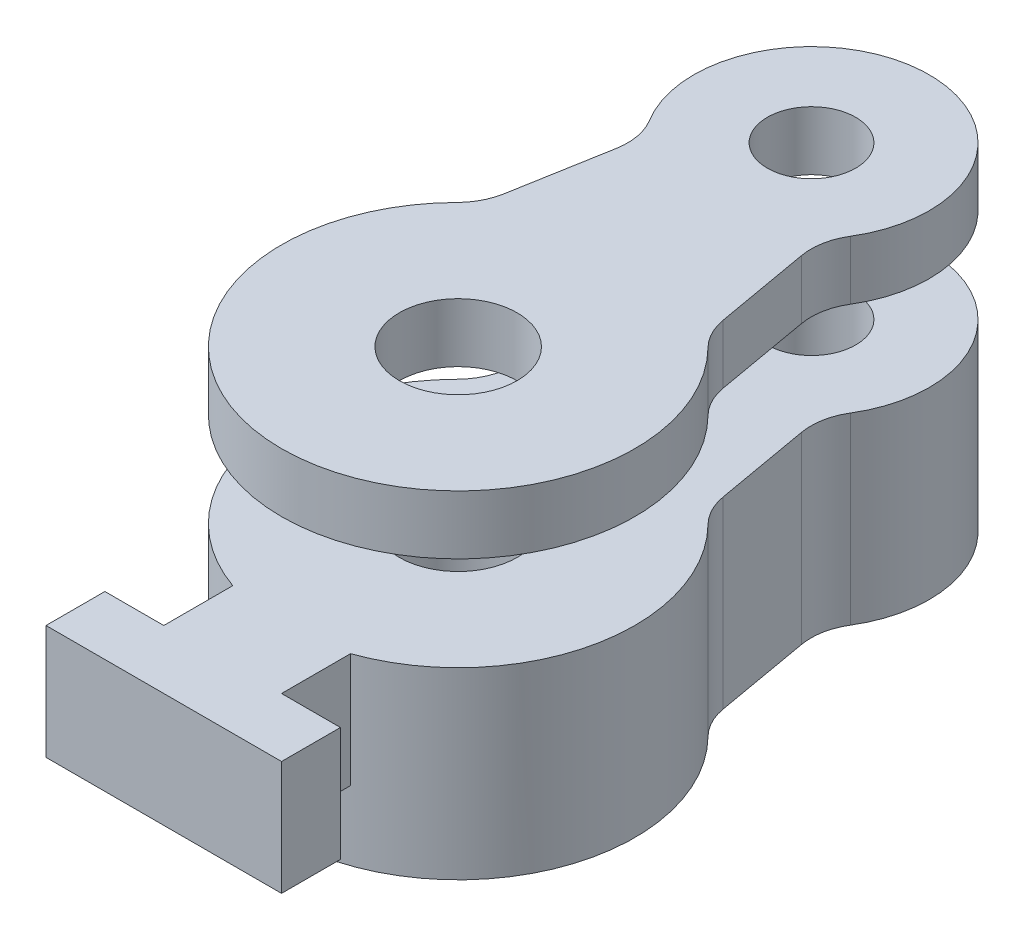
ISO-10303-21;
HEADER;
FILE_DESCRIPTION(('STEP AP214'),'2;1');
FILE_NAME('part.step','',(''),(''),'','','');
FILE_SCHEMA(('AUTOMOTIVE_DESIGN { 1 0 10303 214 1 1 1 1 }'));
ENDSEC;
DATA;
#1=APPLICATION_CONTEXT('core data for automotive mechanical design processes');
#2=APPLICATION_PROTOCOL_DEFINITION('international standard','automotive_design',2000,#1);
#3=PRODUCT_CONTEXT('',#1,'mechanical');
#4=PRODUCT('Part','Part','',(#3));
#5=PRODUCT_RELATED_PRODUCT_CATEGORY('part','',(#4));
#6=PRODUCT_DEFINITION_FORMATION('','',#4);
#7=PRODUCT_DEFINITION_CONTEXT('part definition',#1,'design');
#8=PRODUCT_DEFINITION('design','',#6,#7);
#9=PRODUCT_DEFINITION_SHAPE('','',#8);
#10=(LENGTH_UNIT() NAMED_UNIT(*) SI_UNIT(.MILLI.,.METRE.));
#11=(NAMED_UNIT(*) PLANE_ANGLE_UNIT() SI_UNIT($,.RADIAN.));
#12=(NAMED_UNIT(*) SI_UNIT($,.STERADIAN.) SOLID_ANGLE_UNIT());
#13=UNCERTAINTY_MEASURE_WITH_UNIT(LENGTH_MEASURE(1.E-05),#10,'distance_accuracy_value','');
#14=(GEOMETRIC_REPRESENTATION_CONTEXT(3) GLOBAL_UNCERTAINTY_ASSIGNED_CONTEXT((#13)) GLOBAL_UNIT_ASSIGNED_CONTEXT((#10,
#11,#12)) REPRESENTATION_CONTEXT('',''));
#15=CARTESIAN_POINT('',(0.,0.,0.));
#16=DIRECTION('',(0.,0.,1.));
#17=DIRECTION('',(1.,0.,0.));
#18=AXIS2_PLACEMENT_3D('',#15,#16,#17);
#19=CARTESIAN_POINT('',(32.4918940191016,-59.944,-56.3030951389049));
#20=DIRECTION('',(0.,1.,0.));
#21=DIRECTION('',(0.,0.,1.));
#22=AXIS2_PLACEMENT_3D('',#19,#20,#21);
#23=CYLINDRICAL_SURFACE('',#22,12.7);
#24=CARTESIAN_POINT('',(32.4918940191016,-20.32,-56.3030951389049));
#25=DIRECTION('',(0.,-1.,0.));
#26=DIRECTION('',(0.,0.,1.));
#27=AXIS2_PLACEMENT_3D('',#24,#25,#26);
#28=CIRCLE('',#27,12.7);
#29=CARTESIAN_POINT('',(19.9848355558466,-20.32,-54.0977632825349));
#30=VERTEX_POINT('',#29);
#31=CARTESIAN_POINT('',(21.6612626794011,-20.32,-62.9353967592699));
#32=VERTEX_POINT('',#31);
#33=EDGE_CURVE('E158',#30,#32,#28,.T.);
#34=ORIENTED_EDGE('',*,*,#33,.F.);
#35=DIRECTION('',(0.,1.,0.));
#36=VECTOR('',#35,1.);
#37=CARTESIAN_POINT('',(19.9848355558466,-59.944,-54.0977632825349));
#38=LINE('',#37,#36);
#39=CARTESIAN_POINT('',(19.9848355558466,-59.944,-54.0977632825349));
#40=VERTEX_POINT('',#39);
#41=EDGE_CURVE('E12',#40,#30,#38,.T.);
#42=ORIENTED_EDGE('',*,*,#41,.F.);
#43=CARTESIAN_POINT('',(32.4918940191016,-59.944,-56.3030951389049));
#44=DIRECTION('',(0.,-1.,0.));
#45=DIRECTION('',(0.,0.,1.));
#46=AXIS2_PLACEMENT_3D('',#43,#44,#45);
#47=CIRCLE('',#46,12.7);
#48=CARTESIAN_POINT('',(21.6612626794011,-59.944,-62.9353967592699));
#49=VERTEX_POINT('',#48);
#50=EDGE_CURVE('E181',#40,#49,#47,.T.);
#51=ORIENTED_EDGE('',*,*,#50,.T.);
#52=DIRECTION('',(0.,1.,0.));
#53=VECTOR('',#52,1.);
#54=CARTESIAN_POINT('',(21.6612626794011,-59.944,-62.9353967592699));
#55=LINE('',#54,#53);
#56=EDGE_CURVE('E50',#49,#32,#55,.T.);
#57=ORIENTED_EDGE('',*,*,#56,.T.);
#58=EDGE_LOOP('',(#34,#42,#51,#57));
#59=FACE_BOUND('',#58,.T.);
#60=ADVANCED_FACE('F47',(#59),#23,.F.);
#61=CARTESIAN_POINT('',(23.6142597591815,-59.944,-33.5142757824811));
#62=DIRECTION('',(0.984807753012208,0.,-0.173648177666931));
#63=DIRECTION('',(-0.173648177666931,0.,-0.984807753012208));
#64=AXIS2_PLACEMENT_3D('',#61,#62,#63);
#65=PLANE('',#64);
#66=DIRECTION('',(-0.173648177666931,0.,-0.984807753012208));
#67=VECTOR('',#66,1.);
#68=CARTESIAN_POINT('',(23.6142597591815,-20.32,-33.5142757824811));
#69=LINE('',#68,#67);
#70=CARTESIAN_POINT('',(23.6142597591815,-20.32,-33.5142757824811));
#71=VERTEX_POINT('',#70);
#72=EDGE_CURVE('E179',#71,#30,#69,.T.);
#73=ORIENTED_EDGE('',*,*,#72,.F.);
#74=DIRECTION('',(0.,1.,0.));
#75=VECTOR('',#74,1.);
#76=CARTESIAN_POINT('',(23.6142597591815,-59.944,-33.5142757824811));
#77=LINE('',#76,#75);
#78=CARTESIAN_POINT('',(23.6142597591815,-59.944,-33.5142757824811));
#79=VERTEX_POINT('',#78);
#80=EDGE_CURVE('E55',#79,#71,#77,.T.);
#81=ORIENTED_EDGE('',*,*,#80,.F.);
#82=DIRECTION('',(-0.173648177666931,0.,-0.984807753012208));
#83=VECTOR('',#82,1.);
#84=CARTESIAN_POINT('',(23.6142597591815,-59.944,-33.5142757824811));
#85=LINE('',#84,#83);
#86=EDGE_CURVE('E146',#79,#40,#85,.T.);
#87=ORIENTED_EDGE('',*,*,#86,.T.);
#88=ORIENTED_EDGE('',*,*,#41,.T.);
#89=EDGE_LOOP('',(#73,#81,#87,#88));
#90=FACE_BOUND('',#89,.T.);
#91=ADVANCED_FACE('F192',(#90),#65,.T.);
#92=CARTESIAN_POINT('',(36.1213182224366,-59.944,-35.7196076388512));
#93=DIRECTION('',(0.,1.,0.));
#94=DIRECTION('',(0.,0.,1.));
#95=AXIS2_PLACEMENT_3D('',#92,#93,#94);
#96=CYLINDRICAL_SURFACE('',#95,12.7);
#97=CARTESIAN_POINT('',(36.1213182224366,-20.32,-35.7196076388512));
#98=DIRECTION('',(0.,-1.,0.));
#99=DIRECTION('',(0.,0.,1.));
#100=AXIS2_PLACEMENT_3D('',#97,#98,#99);
#101=CIRCLE('',#100,12.7);
#102=CARTESIAN_POINT('',(27.0909886668275,-20.32,-26.7897057291383));
#103=VERTEX_POINT('',#102);
#104=EDGE_CURVE('E134',#103,#71,#101,.T.);
#105=ORIENTED_EDGE('',*,*,#104,.F.);
#106=DIRECTION('',(0.,1.,0.));
#107=VECTOR('',#106,1.);
#108=CARTESIAN_POINT('',(27.0909886668275,-59.944,-26.7897057291383));
#109=LINE('',#108,#107);
#110=CARTESIAN_POINT('',(27.0909886668275,-59.944,-26.7897057291383));
#111=VERTEX_POINT('',#110);
#112=EDGE_CURVE('E128',#111,#103,#109,.T.);
#113=ORIENTED_EDGE('',*,*,#112,.F.);
#114=CARTESIAN_POINT('',(36.1213182224366,-59.944,-35.7196076388512));
#115=DIRECTION('',(0.,-1.,0.));
#116=DIRECTION('',(0.,0.,1.));
#117=AXIS2_PLACEMENT_3D('',#114,#115,#116);
#118=CIRCLE('',#117,12.7);
#119=EDGE_CURVE('E131',#111,#79,#118,.T.);
#120=ORIENTED_EDGE('',*,*,#119,.T.);
#121=ORIENTED_EDGE('',*,*,#80,.T.);
#122=EDGE_LOOP('',(#105,#113,#120,#121));
#123=FACE_BOUND('',#122,.T.);
#124=ADVANCED_FACE('F130',(#123),#96,.F.);
#125=CARTESIAN_POINT('',(0.,-59.944,0.));
#126=DIRECTION('',(0.,1.,0.));
#127=DIRECTION('',(0.,0.,1.));
#128=AXIS2_PLACEMENT_3D('',#125,#126,#127);
#129=CYLINDRICAL_SURFACE('',#128,38.1);
#130=DIRECTION('',(0.,1.,0.));
#131=VECTOR('',#130,1.);
#132=CARTESIAN_POINT('',(12.7,-44.958,35.9210244842766));
#133=LINE('',#132,#131);
#134=CARTESIAN_POINT('',(12.7,-44.958,35.9210244842766));
#135=VERTEX_POINT('',#134);
#136=CARTESIAN_POINT('',(12.7,-20.32,35.9210244842766));
#137=VERTEX_POINT('',#136);
#138=EDGE_CURVE('E286',#135,#137,#133,.T.);
#139=ORIENTED_EDGE('',*,*,#138,.F.);
#140=CARTESIAN_POINT('',(0.,-44.958,-3.67761376907083E-13));
#141=DIRECTION('',(0.,-1.,0.));
#142=DIRECTION('',(0.,0.,1.));
#143=AXIS2_PLACEMENT_3D('',#140,#141,#142);
#144=CIRCLE('',#143,38.1000000000004);
#145=CARTESIAN_POINT('',(-12.7,-44.958,35.9210244842766));
#146=VERTEX_POINT('',#145);
#147=EDGE_CURVE('E273',#135,#146,#144,.T.);
#148=ORIENTED_EDGE('',*,*,#147,.T.);
#149=DIRECTION('',(0.,1.,0.));
#150=VECTOR('',#149,1.);
#151=CARTESIAN_POINT('',(-12.7,-44.958,35.9210244842766));
#152=LINE('',#151,#150);
#153=CARTESIAN_POINT('',(-12.7,-20.32,35.9210244842766));
#154=VERTEX_POINT('',#153);
#155=EDGE_CURVE('E290',#146,#154,#152,.T.);
#156=ORIENTED_EDGE('',*,*,#155,.T.);
#157=CARTESIAN_POINT('',(0.,-20.32,0.));
#158=DIRECTION('',(0.,1.,0.));
#159=DIRECTION('',(0.,0.,1.));
#160=AXIS2_PLACEMENT_3D('',#157,#158,#159);
#161=CIRCLE('',#160,38.1);
#162=CARTESIAN_POINT('',(-27.0909886668274,-20.32,-26.7897057291384));
#163=VERTEX_POINT('',#162);
#164=EDGE_CURVE('E175',#163,#154,#161,.T.);
#165=ORIENTED_EDGE('',*,*,#164,.F.);
#166=DIRECTION('',(0.,1.,0.));
#167=VECTOR('',#166,1.);
#168=CARTESIAN_POINT('',(-27.0909886668274,-59.944,-26.7897057291384));
#169=LINE('',#168,#167);
#170=CARTESIAN_POINT('',(-27.0909886668274,-59.944,-26.7897057291384));
#171=VERTEX_POINT('',#170);
#172=EDGE_CURVE('E138',#171,#163,#169,.T.);
#173=ORIENTED_EDGE('',*,*,#172,.F.);
#174=CARTESIAN_POINT('',(0.,-59.944,0.));
#175=DIRECTION('',(0.,1.,0.));
#176=DIRECTION('',(0.,0.,1.));
#177=AXIS2_PLACEMENT_3D('',#174,#175,#176);
#178=CIRCLE('',#177,38.1);
#179=EDGE_CURVE('E144',#171,#111,#178,.T.);
#180=ORIENTED_EDGE('',*,*,#179,.T.);
#181=ORIENTED_EDGE('',*,*,#112,.T.);
#182=EDGE_CURVE('E174',#137,#103,#161,.T.);
#183=ORIENTED_EDGE('',*,*,#182,.F.);
#184=EDGE_LOOP('',(#139,#148,#156,#165,#173,#180,#181,#183));
#185=FACE_BOUND('',#184,.T.);
#186=ADVANCED_FACE('F149',(#185),#129,.T.);
#187=CARTESIAN_POINT('',(-36.1213182224366,-59.944,-35.7196076388512));
#188=DIRECTION('',(0.,1.,0.));
#189=DIRECTION('',(0.,0.,1.));
#190=AXIS2_PLACEMENT_3D('',#187,#188,#189);
#191=CYLINDRICAL_SURFACE('',#190,12.7);
#192=CARTESIAN_POINT('',(-36.1213182224366,-20.32,-35.7196076388512));
#193=DIRECTION('',(0.,-1.,0.));
#194=DIRECTION('',(0.,0.,1.));
#195=AXIS2_PLACEMENT_3D('',#192,#193,#194);
#196=CIRCLE('',#195,12.7);
#197=CARTESIAN_POINT('',(-23.6142597591815,-20.32,-33.5142757824811));
#198=VERTEX_POINT('',#197);
#199=EDGE_CURVE('E171',#198,#163,#196,.T.);
#200=ORIENTED_EDGE('',*,*,#199,.F.);
#201=DIRECTION('',(0.,1.,0.));
#202=VECTOR('',#201,1.);
#203=CARTESIAN_POINT('',(-23.6142597591815,-59.944,-33.5142757824811));
#204=LINE('',#203,#202);
#205=CARTESIAN_POINT('',(-23.6142597591815,-59.944,-33.5142757824811));
#206=VERTEX_POINT('',#205);
#207=EDGE_CURVE('E185',#206,#198,#204,.T.);
#208=ORIENTED_EDGE('',*,*,#207,.F.);
#209=CARTESIAN_POINT('',(-36.1213182224366,-59.944,-35.7196076388512));
#210=DIRECTION('',(0.,-1.,0.));
#211=DIRECTION('',(0.,0.,1.));
#212=AXIS2_PLACEMENT_3D('',#209,#210,#211);
#213=CIRCLE('',#212,12.7);
#214=EDGE_CURVE('E151',#206,#171,#213,.T.);
#215=ORIENTED_EDGE('',*,*,#214,.T.);
#216=ORIENTED_EDGE('',*,*,#172,.T.);
#217=EDGE_LOOP('',(#200,#208,#215,#216));
#218=FACE_BOUND('',#217,.T.);
#219=ADVANCED_FACE('F205',(#218),#191,.F.);
#220=CARTESIAN_POINT('',(-19.9848355558466,-59.944,-54.0977632825349));
#221=DIRECTION('',(-0.984807753012208,0.,-0.173648177666932));
#222=DIRECTION('',(-0.173648177666932,0.,0.984807753012208));
#223=AXIS2_PLACEMENT_3D('',#220,#221,#222);
#224=PLANE('',#223);
#225=DIRECTION('',(-0.173648177666932,0.,0.984807753012208));
#226=VECTOR('',#225,1.);
#227=CARTESIAN_POINT('',(-19.9848355558466,-20.32,-54.0977632825349));
#228=LINE('',#227,#226);
#229=CARTESIAN_POINT('',(-19.9848355558466,-20.32,-54.0977632825349));
#230=VERTEX_POINT('',#229);
#231=EDGE_CURVE('E168',#230,#198,#228,.T.);
#232=ORIENTED_EDGE('',*,*,#231,.F.);
#233=DIRECTION('',(0.,1.,0.));
#234=VECTOR('',#233,1.);
#235=CARTESIAN_POINT('',(-19.9848355558466,-59.944,-54.0977632825349));
#236=LINE('',#235,#234);
#237=CARTESIAN_POINT('',(-19.9848355558466,-59.944,-54.0977632825349));
#238=VERTEX_POINT('',#237);
#239=EDGE_CURVE('E187',#238,#230,#236,.T.);
#240=ORIENTED_EDGE('',*,*,#239,.F.);
#241=DIRECTION('',(-0.173648177666932,0.,0.984807753012208));
#242=VECTOR('',#241,1.);
#243=CARTESIAN_POINT('',(-19.9848355558466,-59.944,-54.0977632825349));
#244=LINE('',#243,#242);
#245=EDGE_CURVE('E153',#238,#206,#244,.T.);
#246=ORIENTED_EDGE('',*,*,#245,.T.);
#247=ORIENTED_EDGE('',*,*,#207,.T.);
#248=EDGE_LOOP('',(#232,#240,#246,#247));
#249=FACE_BOUND('',#248,.T.);
#250=ADVANCED_FACE('F208',(#249),#224,.T.);
#251=CARTESIAN_POINT('',(-32.4918940191016,-59.944,-56.3030951389049));
#252=DIRECTION('',(0.,1.,0.));
#253=DIRECTION('',(0.,0.,1.));
#254=AXIS2_PLACEMENT_3D('',#251,#252,#253);
#255=CYLINDRICAL_SURFACE('',#254,12.7);
#256=CARTESIAN_POINT('',(-32.4918940191016,-20.32,-56.3030951389049));
#257=DIRECTION('',(0.,-1.,0.));
#258=DIRECTION('',(0.,0.,1.));
#259=AXIS2_PLACEMENT_3D('',#256,#257,#258);
#260=CIRCLE('',#259,12.7);
#261=CARTESIAN_POINT('',(-21.6612626794011,-20.32,-62.93539675927));
#262=VERTEX_POINT('',#261);
#263=EDGE_CURVE('E165',#262,#230,#260,.T.);
#264=ORIENTED_EDGE('',*,*,#263,.F.);
#265=DIRECTION('',(0.,1.,0.));
#266=VECTOR('',#265,1.);
#267=CARTESIAN_POINT('',(-21.6612626794011,-59.944,-62.93539675927));
#268=LINE('',#267,#266);
#269=CARTESIAN_POINT('',(-21.6612626794011,-59.944,-62.93539675927));
#270=VERTEX_POINT('',#269);
#271=EDGE_CURVE('E188',#270,#262,#268,.T.);
#272=ORIENTED_EDGE('',*,*,#271,.F.);
#273=CARTESIAN_POINT('',(-32.4918940191016,-59.944,-56.3030951389049));
#274=DIRECTION('',(0.,-1.,0.));
#275=DIRECTION('',(0.,0.,1.));
#276=AXIS2_PLACEMENT_3D('',#273,#274,#275);
#277=CIRCLE('',#276,12.7);
#278=EDGE_CURVE('E327',#270,#238,#277,.T.);
#279=ORIENTED_EDGE('',*,*,#278,.T.);
#280=ORIENTED_EDGE('',*,*,#239,.T.);
#281=EDGE_LOOP('',(#264,#272,#279,#280));
#282=FACE_BOUND('',#281,.T.);
#283=ADVANCED_FACE('F212',(#282),#255,.F.);
#284=CARTESIAN_POINT('',(0.,-59.944,-76.2));
#285=DIRECTION('',(0.,1.,0.));
#286=DIRECTION('',(0.,0.,1.));
#287=AXIS2_PLACEMENT_3D('',#284,#285,#286);
#288=CYLINDRICAL_SURFACE('',#287,25.4);
#289=CARTESIAN_POINT('',(0.,-20.32,-76.2));
#290=DIRECTION('',(0.,1.,0.));
#291=DIRECTION('',(0.,0.,1.));
#292=AXIS2_PLACEMENT_3D('',#289,#290,#291);
#293=CIRCLE('',#292,25.4);
#294=EDGE_CURVE('E161',#32,#262,#293,.T.);
#295=ORIENTED_EDGE('',*,*,#294,.F.);
#296=ORIENTED_EDGE('',*,*,#56,.F.);
#297=CARTESIAN_POINT('',(0.,-59.944,-76.2));
#298=DIRECTION('',(0.,1.,0.));
#299=DIRECTION('',(0.,0.,1.));
#300=AXIS2_PLACEMENT_3D('',#297,#298,#299);
#301=CIRCLE('',#300,25.4);
#302=EDGE_CURVE('E325',#49,#270,#301,.T.);
#303=ORIENTED_EDGE('',*,*,#302,.T.);
#304=ORIENTED_EDGE('',*,*,#271,.T.);
#305=EDGE_LOOP('',(#295,#296,#303,#304));
#306=FACE_BOUND('',#305,.T.);
#307=ADVANCED_FACE('F190',(#306),#288,.T.);
#308=CARTESIAN_POINT('',(32.4918940191016,-59.944,-56.3030951389049));
#309=DIRECTION('',(0.,1.,0.));
#310=DIRECTION('',(0.,0.,1.));
#311=AXIS2_PLACEMENT_3D('',#308,#309,#310);
#312=PLANE('',#311);
#313=CARTESIAN_POINT('',(0.,-59.944,0.));
#314=DIRECTION('',(0.,1.,0.));
#315=DIRECTION('',(0.,0.,1.));
#316=AXIS2_PLACEMENT_3D('',#313,#314,#315);
#317=CIRCLE('',#316,12.7);
#318=CARTESIAN_POINT('',(0.,-59.944,12.7));
#319=VERTEX_POINT('',#318);
#320=EDGE_CURVE('E296',#319,#319,#317,.T.);
#321=ORIENTED_EDGE('',*,*,#320,.T.);
#322=EDGE_LOOP('',(#321));
#323=FACE_BOUND('',#322,.T.);
#324=CARTESIAN_POINT('',(0.,-59.944,-76.2));
#325=DIRECTION('',(0.,1.,0.));
#326=DIRECTION('',(0.,0.,1.));
#327=AXIS2_PLACEMENT_3D('',#324,#325,#326);
#328=CIRCLE('',#327,9.52500000000001);
#329=CARTESIAN_POINT('',(0.,-59.944,-66.675));
#330=VERTEX_POINT('',#329);
#331=EDGE_CURVE('E162',#330,#330,#328,.T.);
#332=ORIENTED_EDGE('',*,*,#331,.T.);
#333=EDGE_LOOP('',(#332));
#334=FACE_BOUND('',#333,.T.);
#335=ORIENTED_EDGE('',*,*,#50,.F.);
#336=ORIENTED_EDGE('',*,*,#86,.F.);
#337=ORIENTED_EDGE('',*,*,#119,.F.);
#338=ORIENTED_EDGE('',*,*,#179,.F.);
#339=ORIENTED_EDGE('',*,*,#214,.F.);
#340=ORIENTED_EDGE('',*,*,#245,.F.);
#341=ORIENTED_EDGE('',*,*,#278,.F.);
#342=ORIENTED_EDGE('',*,*,#302,.F.);
#343=EDGE_LOOP('',(#335,#336,#337,#338,#339,#340,#341,#342));
#344=FACE_BOUND('',#343,.T.);
#345=ADVANCED_FACE('F142',(#323,#334,#344),#312,.F.);
#346=CARTESIAN_POINT('',(32.4918940191016,-20.32,-56.3030951389049));
#347=DIRECTION('',(0.,1.,0.));
#348=DIRECTION('',(0.,0.,1.));
#349=AXIS2_PLACEMENT_3D('',#346,#347,#348);
#350=PLANE('',#349);
#351=CARTESIAN_POINT('',(0.,-20.32,0.));
#352=DIRECTION('',(0.,1.,0.));
#353=DIRECTION('',(0.,0.,1.));
#354=AXIS2_PLACEMENT_3D('',#351,#352,#353);
#355=CIRCLE('',#354,12.7);
#356=CARTESIAN_POINT('',(0.,-20.32,12.7));
#357=VERTEX_POINT('',#356);
#358=EDGE_CURVE('E293',#357,#357,#355,.T.);
#359=ORIENTED_EDGE('',*,*,#358,.F.);
#360=EDGE_LOOP('',(#359));
#361=FACE_BOUND('',#360,.T.);
#362=CARTESIAN_POINT('',(0.,-20.32,-76.2));
#363=DIRECTION('',(0.,1.,0.));
#364=DIRECTION('',(0.,0.,1.));
#365=AXIS2_PLACEMENT_3D('',#362,#363,#364);
#366=CIRCLE('',#365,9.52500000000001);
#367=CARTESIAN_POINT('',(0.,-20.32,-66.675));
#368=VERTEX_POINT('',#367);
#369=EDGE_CURVE('E318',#368,#368,#366,.T.);
#370=ORIENTED_EDGE('',*,*,#369,.F.);
#371=EDGE_LOOP('',(#370));
#372=FACE_BOUND('',#371,.T.);
#373=ORIENTED_EDGE('',*,*,#33,.T.);
#374=ORIENTED_EDGE('',*,*,#294,.T.);
#375=ORIENTED_EDGE('',*,*,#263,.T.);
#376=ORIENTED_EDGE('',*,*,#231,.T.);
#377=ORIENTED_EDGE('',*,*,#199,.T.);
#378=ORIENTED_EDGE('',*,*,#164,.T.);
#379=DIRECTION('',(0.,0.,1.));
#380=VECTOR('',#379,1.);
#381=CARTESIAN_POINT('',(-12.7,-20.32,35.9210244842766));
#382=LINE('',#381,#380);
#383=CARTESIAN_POINT('',(-12.7,-20.32,50.8));
#384=VERTEX_POINT('',#383);
#385=EDGE_CURVE('E341',#154,#384,#382,.T.);
#386=ORIENTED_EDGE('',*,*,#385,.T.);
#387=DIRECTION('',(-1.,0.,0.));
#388=VECTOR('',#387,1.);
#389=CARTESIAN_POINT('',(-12.7,-20.32,50.8));
#390=LINE('',#389,#388);
#391=CARTESIAN_POINT('',(-25.4,-20.32,50.8));
#392=VERTEX_POINT('',#391);
#393=EDGE_CURVE('E383',#384,#392,#390,.T.);
#394=ORIENTED_EDGE('',*,*,#393,.T.);
#395=DIRECTION('',(0.,0.,1.));
#396=VECTOR('',#395,1.);
#397=CARTESIAN_POINT('',(-25.4,-20.32,50.8));
#398=LINE('',#397,#396);
#399=CARTESIAN_POINT('',(-25.4,-20.32,63.5));
#400=VERTEX_POINT('',#399);
#401=EDGE_CURVE('E379',#392,#400,#398,.T.);
#402=ORIENTED_EDGE('',*,*,#401,.T.);
#403=DIRECTION('',(1.,0.,0.));
#404=VECTOR('',#403,1.);
#405=CARTESIAN_POINT('',(-25.4,-20.32,63.5));
#406=LINE('',#405,#404);
#407=CARTESIAN_POINT('',(25.4,-20.32,63.5));
#408=VERTEX_POINT('',#407);
#409=EDGE_CURVE('E377',#400,#408,#406,.T.);
#410=ORIENTED_EDGE('',*,*,#409,.T.);
#411=DIRECTION('',(0.,0.,-1.));
#412=VECTOR('',#411,1.);
#413=CARTESIAN_POINT('',(25.4,-20.32,63.5));
#414=LINE('',#413,#412);
#415=CARTESIAN_POINT('',(25.4,-20.32,50.8));
#416=VERTEX_POINT('',#415);
#417=EDGE_CURVE('E370',#408,#416,#414,.T.);
#418=ORIENTED_EDGE('',*,*,#417,.T.);
#419=DIRECTION('',(-1.,0.,0.));
#420=VECTOR('',#419,1.);
#421=CARTESIAN_POINT('',(25.4,-20.32,50.8));
#422=LINE('',#421,#420);
#423=CARTESIAN_POINT('',(12.7,-20.32,50.8));
#424=VERTEX_POINT('',#423);
#425=EDGE_CURVE('E374',#416,#424,#422,.T.);
#426=ORIENTED_EDGE('',*,*,#425,.T.);
#427=DIRECTION('',(0.,0.,-1.));
#428=VECTOR('',#427,1.);
#429=CARTESIAN_POINT('',(12.7,-20.32,50.8));
#430=LINE('',#429,#428);
#431=EDGE_CURVE('E63',#424,#137,#430,.T.);
#432=ORIENTED_EDGE('',*,*,#431,.T.);
#433=ORIENTED_EDGE('',*,*,#182,.T.);
#434=ORIENTED_EDGE('',*,*,#104,.T.);
#435=ORIENTED_EDGE('',*,*,#72,.T.);
#436=EDGE_LOOP('',(#373,#374,#375,#376,#377,#378,#386,#394,#402,#410,#418,#426,#432,#433,#434,#435));
#437=FACE_BOUND('',#436,.T.);
#438=ADVANCED_FACE('F191',(#361,#372,#437),#350,.T.);
#439=CARTESIAN_POINT('',(0.,-59.944,-76.2));
#440=DIRECTION('',(0.,1.,0.));
#441=DIRECTION('',(0.,0.,1.));
#442=AXIS2_PLACEMENT_3D('',#439,#440,#441);
#443=CYLINDRICAL_SURFACE('',#442,9.52500000000001);
#444=ORIENTED_EDGE('',*,*,#331,.F.);
#445=EDGE_LOOP('',(#444));
#446=FACE_BOUND('',#445,.T.);
#447=ORIENTED_EDGE('',*,*,#369,.T.);
#448=EDGE_LOOP('',(#447));
#449=FACE_BOUND('',#448,.T.);
#450=ADVANCED_FACE('F224',(#446,#449),#443,.F.);
#451=CARTESIAN_POINT('',(0.,-59.944,0.));
#452=DIRECTION('',(0.,1.,0.));
#453=DIRECTION('',(0.,0.,1.));
#454=AXIS2_PLACEMENT_3D('',#451,#452,#453);
#455=CYLINDRICAL_SURFACE('',#454,12.7);
#456=ORIENTED_EDGE('',*,*,#320,.F.);
#457=EDGE_LOOP('',(#456));
#458=FACE_BOUND('',#457,.T.);
#459=ORIENTED_EDGE('',*,*,#358,.T.);
#460=EDGE_LOOP('',(#459));
#461=FACE_BOUND('',#460,.T.);
#462=ADVANCED_FACE('F231',(#458,#461),#455,.F.);
#463=CARTESIAN_POINT('',(12.7,-44.958,50.8));
#464=DIRECTION('',(1.,0.,0.));
#465=DIRECTION('',(0.,0.,-1.));
#466=AXIS2_PLACEMENT_3D('',#463,#464,#465);
#467=PLANE('',#466);
#468=ORIENTED_EDGE('',*,*,#431,.F.);
#469=DIRECTION('',(0.,1.,0.));
#470=VECTOR('',#469,1.);
#471=CARTESIAN_POINT('',(12.7,-44.958,50.8));
#472=LINE('',#471,#470);
#473=CARTESIAN_POINT('',(12.7,-44.958,50.8));
#474=VERTEX_POINT('',#473);
#475=EDGE_CURVE('E288',#474,#424,#472,.T.);
#476=ORIENTED_EDGE('',*,*,#475,.F.);
#477=DIRECTION('',(0.,0.,-1.));
#478=VECTOR('',#477,1.);
#479=CARTESIAN_POINT('',(12.7,-44.958,50.8));
#480=LINE('',#479,#478);
#481=EDGE_CURVE('E277',#474,#135,#480,.T.);
#482=ORIENTED_EDGE('',*,*,#481,.T.);
#483=ORIENTED_EDGE('',*,*,#138,.T.);
#484=EDGE_LOOP('',(#468,#476,#482,#483));
#485=FACE_BOUND('',#484,.T.);
#486=ADVANCED_FACE('F235',(#485),#467,.T.);
#487=CARTESIAN_POINT('',(25.4,-44.958,50.8));
#488=DIRECTION('',(0.,0.,-1.));
#489=DIRECTION('',(-1.,0.,0.));
#490=AXIS2_PLACEMENT_3D('',#487,#488,#489);
#491=PLANE('',#490);
#492=ORIENTED_EDGE('',*,*,#425,.F.);
#493=DIRECTION('',(0.,1.,0.));
#494=VECTOR('',#493,1.);
#495=CARTESIAN_POINT('',(25.4,-44.958,50.8));
#496=LINE('',#495,#494);
#497=CARTESIAN_POINT('',(25.4,-44.958,50.8));
#498=VERTEX_POINT('',#497);
#499=EDGE_CURVE('E298',#498,#416,#496,.T.);
#500=ORIENTED_EDGE('',*,*,#499,.F.);
#501=DIRECTION('',(-1.,0.,0.));
#502=VECTOR('',#501,1.);
#503=CARTESIAN_POINT('',(25.4,-44.958,50.8));
#504=LINE('',#503,#502);
#505=EDGE_CURVE('E291',#498,#474,#504,.T.);
#506=ORIENTED_EDGE('',*,*,#505,.T.);
#507=ORIENTED_EDGE('',*,*,#475,.T.);
#508=EDGE_LOOP('',(#492,#500,#506,#507));
#509=FACE_BOUND('',#508,.T.);
#510=ADVANCED_FACE('F257',(#509),#491,.T.);
#511=CARTESIAN_POINT('',(25.4,-44.958,63.5));
#512=DIRECTION('',(1.,0.,0.));
#513=DIRECTION('',(0.,0.,-1.));
#514=AXIS2_PLACEMENT_3D('',#511,#512,#513);
#515=PLANE('',#514);
#516=ORIENTED_EDGE('',*,*,#417,.F.);
#517=DIRECTION('',(0.,1.,0.));
#518=VECTOR('',#517,1.);
#519=CARTESIAN_POINT('',(25.4,-44.958,63.5));
#520=LINE('',#519,#518);
#521=CARTESIAN_POINT('',(25.4,-44.958,63.5));
#522=VERTEX_POINT('',#521);
#523=EDGE_CURVE('E305',#522,#408,#520,.T.);
#524=ORIENTED_EDGE('',*,*,#523,.F.);
#525=DIRECTION('',(0.,0.,-1.));
#526=VECTOR('',#525,1.);
#527=CARTESIAN_POINT('',(25.4,-44.958,63.5));
#528=LINE('',#527,#526);
#529=EDGE_CURVE('E373',#522,#498,#528,.T.);
#530=ORIENTED_EDGE('',*,*,#529,.T.);
#531=ORIENTED_EDGE('',*,*,#499,.T.);
#532=EDGE_LOOP('',(#516,#524,#530,#531));
#533=FACE_BOUND('',#532,.T.);
#534=ADVANCED_FACE('F253',(#533),#515,.T.);
#535=CARTESIAN_POINT('',(-25.4,-44.958,63.5));
#536=DIRECTION('',(0.,0.,1.));
#537=DIRECTION('',(1.,0.,0.));
#538=AXIS2_PLACEMENT_3D('',#535,#536,#537);
#539=PLANE('',#538);
#540=ORIENTED_EDGE('',*,*,#409,.F.);
#541=DIRECTION('',(0.,1.,0.));
#542=VECTOR('',#541,1.);
#543=CARTESIAN_POINT('',(-25.4,-44.958,63.5));
#544=LINE('',#543,#542);
#545=CARTESIAN_POINT('',(-25.4,-44.958,63.5));
#546=VERTEX_POINT('',#545);
#547=EDGE_CURVE('E308',#546,#400,#544,.T.);
#548=ORIENTED_EDGE('',*,*,#547,.F.);
#549=DIRECTION('',(1.,0.,0.));
#550=VECTOR('',#549,1.);
#551=CARTESIAN_POINT('',(-25.4,-44.958,63.5));
#552=LINE('',#551,#550);
#553=EDGE_CURVE('E389',#546,#522,#552,.T.);
#554=ORIENTED_EDGE('',*,*,#553,.T.);
#555=ORIENTED_EDGE('',*,*,#523,.T.);
#556=EDGE_LOOP('',(#540,#548,#554,#555));
#557=FACE_BOUND('',#556,.T.);
#558=ADVANCED_FACE('F249',(#557),#539,.T.);
#559=CARTESIAN_POINT('',(-25.4,-44.958,50.8));
#560=DIRECTION('',(-1.,0.,0.));
#561=DIRECTION('',(0.,0.,1.));
#562=AXIS2_PLACEMENT_3D('',#559,#560,#561);
#563=PLANE('',#562);
#564=ORIENTED_EDGE('',*,*,#401,.F.);
#565=DIRECTION('',(0.,1.,0.));
#566=VECTOR('',#565,1.);
#567=CARTESIAN_POINT('',(-25.4,-44.958,50.8));
#568=LINE('',#567,#566);
#569=CARTESIAN_POINT('',(-25.4,-44.958,50.8));
#570=VERTEX_POINT('',#569);
#571=EDGE_CURVE('E311',#570,#392,#568,.T.);
#572=ORIENTED_EDGE('',*,*,#571,.F.);
#573=DIRECTION('',(0.,0.,1.));
#574=VECTOR('',#573,1.);
#575=CARTESIAN_POINT('',(-25.4,-44.958,50.8));
#576=LINE('',#575,#574);
#577=EDGE_CURVE('E392',#570,#546,#576,.T.);
#578=ORIENTED_EDGE('',*,*,#577,.T.);
#579=ORIENTED_EDGE('',*,*,#547,.T.);
#580=EDGE_LOOP('',(#564,#572,#578,#579));
#581=FACE_BOUND('',#580,.T.);
#582=ADVANCED_FACE('F245',(#581),#563,.T.);
#583=CARTESIAN_POINT('',(-12.7,-44.958,50.8));
#584=DIRECTION('',(0.,0.,-1.));
#585=DIRECTION('',(-1.,0.,0.));
#586=AXIS2_PLACEMENT_3D('',#583,#584,#585);
#587=PLANE('',#586);
#588=ORIENTED_EDGE('',*,*,#393,.F.);
#589=DIRECTION('',(0.,1.,0.));
#590=VECTOR('',#589,1.);
#591=CARTESIAN_POINT('',(-12.7,-44.958,50.8));
#592=LINE('',#591,#590);
#593=CARTESIAN_POINT('',(-12.7,-44.958,50.8));
#594=VERTEX_POINT('',#593);
#595=EDGE_CURVE('E314',#594,#384,#592,.T.);
#596=ORIENTED_EDGE('',*,*,#595,.F.);
#597=DIRECTION('',(-1.,0.,0.));
#598=VECTOR('',#597,1.);
#599=CARTESIAN_POINT('',(-12.7,-44.958,50.8));
#600=LINE('',#599,#598);
#601=EDGE_CURVE('E395',#594,#570,#600,.T.);
#602=ORIENTED_EDGE('',*,*,#601,.T.);
#603=ORIENTED_EDGE('',*,*,#571,.T.);
#604=EDGE_LOOP('',(#588,#596,#602,#603));
#605=FACE_BOUND('',#604,.T.);
#606=ADVANCED_FACE('F241',(#605),#587,.T.);
#607=CARTESIAN_POINT('',(-12.7,-44.958,35.9210244842766));
#608=DIRECTION('',(-1.,0.,0.));
#609=DIRECTION('',(0.,0.,1.));
#610=AXIS2_PLACEMENT_3D('',#607,#608,#609);
#611=PLANE('',#610);
#612=ORIENTED_EDGE('',*,*,#385,.F.);
#613=ORIENTED_EDGE('',*,*,#155,.F.);
#614=DIRECTION('',(0.,0.,1.));
#615=VECTOR('',#614,1.);
#616=CARTESIAN_POINT('',(-12.7,-44.958,35.9210244842766));
#617=LINE('',#616,#615);
#618=EDGE_CURVE('E281',#146,#594,#617,.T.);
#619=ORIENTED_EDGE('',*,*,#618,.T.);
#620=ORIENTED_EDGE('',*,*,#595,.T.);
#621=EDGE_LOOP('',(#612,#613,#619,#620));
#622=FACE_BOUND('',#621,.T.);
#623=ADVANCED_FACE('F237',(#622),#611,.T.);
#624=CARTESIAN_POINT('',(0.,-44.958,-3.67761376907083E-13));
#625=DIRECTION('',(0.,1.,0.));
#626=DIRECTION('',(0.,0.,1.));
#627=AXIS2_PLACEMENT_3D('',#624,#625,#626);
#628=PLANE('',#627);
#629=ORIENTED_EDGE('',*,*,#147,.F.);
#630=ORIENTED_EDGE('',*,*,#481,.F.);
#631=ORIENTED_EDGE('',*,*,#505,.F.);
#632=ORIENTED_EDGE('',*,*,#529,.F.);
#633=ORIENTED_EDGE('',*,*,#553,.F.);
#634=ORIENTED_EDGE('',*,*,#577,.F.);
#635=ORIENTED_EDGE('',*,*,#601,.F.);
#636=ORIENTED_EDGE('',*,*,#618,.F.);
#637=EDGE_LOOP('',(#629,#630,#631,#632,#633,#634,#635,#636));
#638=FACE_BOUND('',#637,.T.);
#639=ADVANCED_FACE('F240',(#638),#628,.F.);
#640=CLOSED_SHELL('',(#60,#91,#124,#186,#219,#250,#283,#307,#345,#438,#450,#462,#486,#510,#534,
#558,#582,#606,#623,#639));
#641=MANIFOLD_SOLID_BREP('B2',#640);
#642=CARTESIAN_POINT('',(0.,12.7,-76.2));
#643=DIRECTION('',(0.,1.,0.));
#644=DIRECTION('',(0.,0.,1.));
#645=AXIS2_PLACEMENT_3D('',#642,#643,#644);
#646=PLANE('',#645);
#647=CARTESIAN_POINT('',(0.,12.7,0.));
#648=DIRECTION('',(0.,1.,0.));
#649=DIRECTION('',(0.,0.,1.));
#650=AXIS2_PLACEMENT_3D('',#647,#648,#649);
#651=CIRCLE('',#650,12.7);
#652=CARTESIAN_POINT('',(0.,12.7,12.7));
#653=VERTEX_POINT('',#652);
#654=EDGE_CURVE('E660',#653,#653,#651,.T.);
#655=ORIENTED_EDGE('',*,*,#654,.F.);
#656=EDGE_LOOP('',(#655));
#657=FACE_BOUND('',#656,.T.);
#658=DIRECTION('',(-0.173648177666932,0.,-0.984807753012208));
#659=VECTOR('',#658,1.);
#660=CARTESIAN_POINT('',(24.3579162597458,12.7,-29.2967901907908));
#661=LINE('',#660,#659);
#662=CARTESIAN_POINT('',(23.6142597591815,12.7,-33.5142757824811));
#663=VERTEX_POINT('',#662);
#664=CARTESIAN_POINT('',(19.9848355558466,12.7,-54.0977632825349));
#665=VERTEX_POINT('',#664);
#666=EDGE_CURVE('E668',#663,#665,#661,.T.);
#667=ORIENTED_EDGE('',*,*,#666,.T.);
#668=CARTESIAN_POINT('',(32.4918940191016,12.7,-56.3030951389049));
#669=DIRECTION('',(0.,1.,0.));
#670=DIRECTION('',(0.,0.,1.));
#671=AXIS2_PLACEMENT_3D('',#668,#669,#670);
#672=CIRCLE('',#671,12.7);
#673=CARTESIAN_POINT('',(21.6612626794011,12.7,-62.93539675927));
#674=VERTEX_POINT('',#673);
#675=EDGE_CURVE('E643',#665,#674,#672,.F.);
#676=ORIENTED_EDGE('',*,*,#675,.T.);
#677=CARTESIAN_POINT('',(0.,12.7,-76.2));
#678=DIRECTION('',(0.,1.,0.));
#679=DIRECTION('',(0.,0.,1.));
#680=AXIS2_PLACEMENT_3D('',#677,#678,#679);
#681=CIRCLE('',#680,25.4);
#682=CARTESIAN_POINT('',(-21.6612626794011,12.7,-62.93539675927));
#683=VERTEX_POINT('',#682);
#684=EDGE_CURVE('E651',#674,#683,#681,.T.);
#685=ORIENTED_EDGE('',*,*,#684,.T.);
#686=CARTESIAN_POINT('',(-32.4918940191016,12.7,-56.3030951389049));
#687=DIRECTION('',(0.,1.,0.));
#688=DIRECTION('',(0.,0.,1.));
#689=AXIS2_PLACEMENT_3D('',#686,#687,#688);
#690=CIRCLE('',#689,12.7);
#691=CARTESIAN_POINT('',(-19.9848355558466,12.7,-54.0977632825349));
#692=VERTEX_POINT('',#691);
#693=EDGE_CURVE('E589',#683,#692,#690,.F.);
#694=ORIENTED_EDGE('',*,*,#693,.T.);
#695=DIRECTION('',(-0.173648177666932,0.,0.984807753012208));
#696=VECTOR('',#695,1.);
#697=CARTESIAN_POINT('',(-24.3579162597458,12.7,-29.2967901907908));
#698=LINE('',#697,#696);
#699=CARTESIAN_POINT('',(-23.6142597591815,12.7,-33.5142757824811));
#700=VERTEX_POINT('',#699);
#701=EDGE_CURVE('E710',#692,#700,#698,.T.);
#702=ORIENTED_EDGE('',*,*,#701,.T.);
#703=CARTESIAN_POINT('',(-36.1213182224366,12.7,-35.7196076388512));
#704=DIRECTION('',(0.,1.,0.));
#705=DIRECTION('',(0.,0.,1.));
#706=AXIS2_PLACEMENT_3D('',#703,#704,#705);
#707=CIRCLE('',#706,12.7);
#708=CARTESIAN_POINT('',(-27.0909886668274,12.7,-26.7897057291384));
#709=VERTEX_POINT('',#708);
#710=EDGE_CURVE('E691',#700,#709,#707,.F.);
#711=ORIENTED_EDGE('',*,*,#710,.T.);
#712=CARTESIAN_POINT('',(0.,12.7,0.));
#713=DIRECTION('',(0.,1.,0.));
#714=DIRECTION('',(0.,0.,1.));
#715=AXIS2_PLACEMENT_3D('',#712,#713,#714);
#716=CIRCLE('',#715,38.1);
#717=CARTESIAN_POINT('',(27.0909886668274,12.7,-26.7897057291384));
#718=VERTEX_POINT('',#717);
#719=EDGE_CURVE('E707',#709,#718,#716,.T.);
#720=ORIENTED_EDGE('',*,*,#719,.T.);
#721=CARTESIAN_POINT('',(36.1213182224366,12.7,-35.7196076388512));
#722=DIRECTION('',(0.,1.,0.));
#723=DIRECTION('',(0.,0.,1.));
#724=AXIS2_PLACEMENT_3D('',#721,#722,#723);
#725=CIRCLE('',#724,12.7);
#726=EDGE_CURVE('E45',#718,#663,#725,.F.);
#727=ORIENTED_EDGE('',*,*,#726,.T.);
#728=EDGE_LOOP('',(#667,#676,#685,#694,#702,#711,#720,#727));
#729=FACE_BOUND('',#728,.T.);
#730=CARTESIAN_POINT('',(0.,12.7,-76.2));
#731=DIRECTION('',(0.,1.,0.));
#732=DIRECTION('',(0.,0.,1.));
#733=AXIS2_PLACEMENT_3D('',#730,#731,#732);
#734=CIRCLE('',#733,9.525);
#735=CARTESIAN_POINT('',(0.,12.7,-66.675));
#736=VERTEX_POINT('',#735);
#737=EDGE_CURVE('E715',#736,#736,#734,.T.);
#738=ORIENTED_EDGE('',*,*,#737,.F.);
#739=EDGE_LOOP('',(#738));
#740=FACE_BOUND('',#739,.T.);
#741=ADVANCED_FACE('F567',(#657,#729,#740),#646,.T.);
#742=CARTESIAN_POINT('',(0.,0.,-76.2));
#743=DIRECTION('',(0.,1.,0.));
#744=DIRECTION('',(0.,0.,1.));
#745=AXIS2_PLACEMENT_3D('',#742,#743,#744);
#746=PLANE('',#745);
#747=CARTESIAN_POINT('',(0.,0.,-76.2));
#748=DIRECTION('',(0.,1.,0.));
#749=DIRECTION('',(0.,0.,1.));
#750=AXIS2_PLACEMENT_3D('',#747,#748,#749);
#751=CIRCLE('',#750,25.4);
#752=CARTESIAN_POINT('',(21.6612626794011,0.,-62.93539675927));
#753=VERTEX_POINT('',#752);
#754=CARTESIAN_POINT('',(-21.6612626794011,0.,-62.93539675927));
#755=VERTEX_POINT('',#754);
#756=EDGE_CURVE('E649',#753,#755,#751,.T.);
#757=ORIENTED_EDGE('',*,*,#756,.F.);
#758=CARTESIAN_POINT('',(32.4918940191016,0.,-56.3030951389049));
#759=DIRECTION('',(0.,1.,0.));
#760=DIRECTION('',(0.,0.,1.));
#761=AXIS2_PLACEMENT_3D('',#758,#759,#760);
#762=CIRCLE('',#761,12.7);
#763=CARTESIAN_POINT('',(19.9848355558466,0.,-54.0977632825349));
#764=VERTEX_POINT('',#763);
#765=EDGE_CURVE('E633',#753,#764,#762,.T.);
#766=ORIENTED_EDGE('',*,*,#765,.T.);
#767=DIRECTION('',(-0.173648177666932,0.,-0.984807753012208));
#768=VECTOR('',#767,1.);
#769=CARTESIAN_POINT('',(24.3579162597458,0.,-29.2967901907908));
#770=LINE('',#769,#768);
#771=CARTESIAN_POINT('',(23.6142597591815,0.,-33.5142757824811));
#772=VERTEX_POINT('',#771);
#773=EDGE_CURVE('E673',#772,#764,#770,.T.);
#774=ORIENTED_EDGE('',*,*,#773,.F.);
#775=CARTESIAN_POINT('',(36.1213182224366,0.,-35.7196076388512));
#776=DIRECTION('',(0.,1.,0.));
#777=DIRECTION('',(0.,0.,1.));
#778=AXIS2_PLACEMENT_3D('',#775,#776,#777);
#779=CIRCLE('',#778,12.7);
#780=CARTESIAN_POINT('',(27.0909886668274,0.,-26.7897057291384));
#781=VERTEX_POINT('',#780);
#782=EDGE_CURVE('E575',#772,#781,#779,.T.);
#783=ORIENTED_EDGE('',*,*,#782,.T.);
#784=CARTESIAN_POINT('',(0.,0.,0.));
#785=DIRECTION('',(0.,1.,0.));
#786=DIRECTION('',(0.,0.,1.));
#787=AXIS2_PLACEMENT_3D('',#784,#785,#786);
#788=CIRCLE('',#787,38.1);
#789=CARTESIAN_POINT('',(-27.0909886668274,0.,-26.7897057291384));
#790=VERTEX_POINT('',#789);
#791=EDGE_CURVE('E662',#790,#781,#788,.T.);
#792=ORIENTED_EDGE('',*,*,#791,.F.);
#793=CARTESIAN_POINT('',(-36.1213182224366,0.,-35.7196076388512));
#794=DIRECTION('',(0.,1.,0.));
#795=DIRECTION('',(0.,0.,1.));
#796=AXIS2_PLACEMENT_3D('',#793,#794,#795);
#797=CIRCLE('',#796,12.7);
#798=CARTESIAN_POINT('',(-23.6142597591815,0.,-33.5142757824811));
#799=VERTEX_POINT('',#798);
#800=EDGE_CURVE('E689',#790,#799,#797,.T.);
#801=ORIENTED_EDGE('',*,*,#800,.T.);
#802=DIRECTION('',(-0.173648177666932,0.,0.984807753012208));
#803=VECTOR('',#802,1.);
#804=CARTESIAN_POINT('',(-24.3579162597458,0.,-29.2967901907908));
#805=LINE('',#804,#803);
#806=CARTESIAN_POINT('',(-19.9848355558466,0.,-54.0977632825349));
#807=VERTEX_POINT('',#806);
#808=EDGE_CURVE('E659',#807,#799,#805,.T.);
#809=ORIENTED_EDGE('',*,*,#808,.F.);
#810=CARTESIAN_POINT('',(-32.4918940191016,0.,-56.3030951389049));
#811=DIRECTION('',(0.,1.,0.));
#812=DIRECTION('',(0.,0.,1.));
#813=AXIS2_PLACEMENT_3D('',#810,#811,#812);
#814=CIRCLE('',#813,12.7);
#815=EDGE_CURVE('E658',#807,#755,#814,.T.);
#816=ORIENTED_EDGE('',*,*,#815,.T.);
#817=EDGE_LOOP('',(#757,#766,#774,#783,#792,#801,#809,#816));
#818=FACE_BOUND('',#817,.T.);
#819=CARTESIAN_POINT('',(0.,0.,0.));
#820=DIRECTION('',(0.,1.,0.));
#821=DIRECTION('',(0.,0.,1.));
#822=AXIS2_PLACEMENT_3D('',#819,#820,#821);
#823=CIRCLE('',#822,12.7);
#824=CARTESIAN_POINT('',(0.,0.,12.7));
#825=VERTEX_POINT('',#824);
#826=EDGE_CURVE('E665',#825,#825,#823,.T.);
#827=ORIENTED_EDGE('',*,*,#826,.T.);
#828=EDGE_LOOP('',(#827));
#829=FACE_BOUND('',#828,.T.);
#830=CARTESIAN_POINT('',(0.,0.,-76.2));
#831=DIRECTION('',(0.,1.,0.));
#832=DIRECTION('',(0.,0.,1.));
#833=AXIS2_PLACEMENT_3D('',#830,#831,#832);
#834=CIRCLE('',#833,9.525);
#835=CARTESIAN_POINT('',(0.,0.,-66.675));
#836=VERTEX_POINT('',#835);
#837=EDGE_CURVE('E717',#836,#836,#834,.T.);
#838=ORIENTED_EDGE('',*,*,#837,.T.);
#839=EDGE_LOOP('',(#838));
#840=FACE_BOUND('',#839,.T.);
#841=ADVANCED_FACE('F655',(#818,#829,#840),#746,.F.);
#842=CARTESIAN_POINT('',(0.,12.7,-76.2));
#843=DIRECTION('',(0.,-1.,0.));
#844=DIRECTION('',(0.,0.,-1.));
#845=AXIS2_PLACEMENT_3D('',#842,#843,#844);
#846=CYLINDRICAL_SURFACE('',#845,25.4);
#847=ORIENTED_EDGE('',*,*,#684,.F.);
#848=DIRECTION('',(0.,-1.,0.));
#849=VECTOR('',#848,1.);
#850=CARTESIAN_POINT('',(21.6612626794011,12.7,-62.93539675927));
#851=LINE('',#850,#849);
#852=EDGE_CURVE('E637',#674,#753,#851,.T.);
#853=ORIENTED_EDGE('',*,*,#852,.T.);
#854=ORIENTED_EDGE('',*,*,#756,.T.);
#855=DIRECTION('',(0.,-1.,0.));
#856=VECTOR('',#855,1.);
#857=CARTESIAN_POINT('',(-21.6612626794011,12.7,-62.93539675927));
#858=LINE('',#857,#856);
#859=EDGE_CURVE('E653',#755,#683,#858,.F.);
#860=ORIENTED_EDGE('',*,*,#859,.T.);
#861=EDGE_LOOP('',(#847,#853,#854,#860));
#862=FACE_BOUND('',#861,.T.);
#863=ADVANCED_FACE('F648',(#862),#846,.T.);
#864=CARTESIAN_POINT('',(-24.3579162597458,12.7,-29.2967901907908));
#865=DIRECTION('',(0.984807753012208,0.,0.173648177666932));
#866=DIRECTION('',(0.173648177666932,0.,-0.984807753012208));
#867=AXIS2_PLACEMENT_3D('',#864,#865,#866);
#868=PLANE('',#867);
#869=ORIENTED_EDGE('',*,*,#808,.T.);
#870=DIRECTION('',(0.,1.,0.));
#871=VECTOR('',#870,1.);
#872=CARTESIAN_POINT('',(-23.6142597591815,12.7,-33.5142757824811));
#873=LINE('',#872,#871);
#874=EDGE_CURVE('E582',#799,#700,#873,.T.);
#875=ORIENTED_EDGE('',*,*,#874,.T.);
#876=ORIENTED_EDGE('',*,*,#701,.F.);
#877=DIRECTION('',(0.,1.,0.));
#878=VECTOR('',#877,1.);
#879=CARTESIAN_POINT('',(-19.9848355558466,0.,-54.0977632825349));
#880=LINE('',#879,#878);
#881=EDGE_CURVE('E684',#692,#807,#880,.F.);
#882=ORIENTED_EDGE('',*,*,#881,.T.);
#883=EDGE_LOOP('',(#869,#875,#876,#882));
#884=FACE_BOUND('',#883,.T.);
#885=ADVANCED_FACE('F741',(#884),#868,.F.);
#886=CARTESIAN_POINT('',(0.,12.7,0.));
#887=DIRECTION('',(0.,-1.,0.));
#888=DIRECTION('',(0.,0.,-1.));
#889=AXIS2_PLACEMENT_3D('',#886,#887,#888);
#890=CYLINDRICAL_SURFACE('',#889,38.1);
#891=ORIENTED_EDGE('',*,*,#719,.F.);
#892=DIRECTION('',(0.,-1.,0.));
#893=VECTOR('',#892,1.);
#894=CARTESIAN_POINT('',(-27.0909886668274,12.7,-26.7897057291384));
#895=LINE('',#894,#893);
#896=EDGE_CURVE('E681',#709,#790,#895,.T.);
#897=ORIENTED_EDGE('',*,*,#896,.T.);
#898=ORIENTED_EDGE('',*,*,#791,.T.);
#899=DIRECTION('',(0.,-1.,0.));
#900=VECTOR('',#899,1.);
#901=CARTESIAN_POINT('',(27.0909886668274,12.7,-26.7897057291384));
#902=LINE('',#901,#900);
#903=EDGE_CURVE('E679',#781,#718,#902,.F.);
#904=ORIENTED_EDGE('',*,*,#903,.T.);
#905=EDGE_LOOP('',(#891,#897,#898,#904));
#906=FACE_BOUND('',#905,.T.);
#907=ADVANCED_FACE('F700',(#906),#890,.T.);
#908=CARTESIAN_POINT('',(24.3579162597458,12.7,-29.2967901907908));
#909=DIRECTION('',(-0.984807753012208,0.,0.173648177666932));
#910=DIRECTION('',(0.173648177666932,0.,0.984807753012208));
#911=AXIS2_PLACEMENT_3D('',#908,#909,#910);
#912=PLANE('',#911);
#913=ORIENTED_EDGE('',*,*,#773,.T.);
#914=DIRECTION('',(0.,1.,0.));
#915=VECTOR('',#914,1.);
#916=CARTESIAN_POINT('',(19.9848355558466,12.7,-54.0977632825349));
#917=LINE('',#916,#915);
#918=EDGE_CURVE('E638',#764,#665,#917,.T.);
#919=ORIENTED_EDGE('',*,*,#918,.T.);
#920=ORIENTED_EDGE('',*,*,#666,.F.);
#921=DIRECTION('',(0.,1.,0.));
#922=VECTOR('',#921,1.);
#923=CARTESIAN_POINT('',(23.6142597591815,0.,-33.5142757824811));
#924=LINE('',#923,#922);
#925=EDGE_CURVE('E652',#663,#772,#924,.F.);
#926=ORIENTED_EDGE('',*,*,#925,.T.);
#927=EDGE_LOOP('',(#913,#919,#920,#926));
#928=FACE_BOUND('',#927,.T.);
#929=ADVANCED_FACE('F709',(#928),#912,.F.);
#930=CARTESIAN_POINT('',(0.,12.7,0.));
#931=DIRECTION('',(0.,-1.,0.));
#932=DIRECTION('',(0.,0.,-1.));
#933=AXIS2_PLACEMENT_3D('',#930,#931,#932);
#934=CYLINDRICAL_SURFACE('',#933,12.7);
#935=ORIENTED_EDGE('',*,*,#654,.T.);
#936=EDGE_LOOP('',(#935));
#937=FACE_BOUND('',#936,.T.);
#938=ORIENTED_EDGE('',*,*,#826,.F.);
#939=EDGE_LOOP('',(#938));
#940=FACE_BOUND('',#939,.T.);
#941=ADVANCED_FACE('F734',(#937,#940),#934,.F.);
#942=CARTESIAN_POINT('',(0.,12.7,-76.2));
#943=DIRECTION('',(0.,-1.,0.));
#944=DIRECTION('',(0.,0.,-1.));
#945=AXIS2_PLACEMENT_3D('',#942,#943,#944);
#946=CYLINDRICAL_SURFACE('',#945,9.525);
#947=ORIENTED_EDGE('',*,*,#737,.T.);
#948=EDGE_LOOP('',(#947));
#949=FACE_BOUND('',#948,.T.);
#950=ORIENTED_EDGE('',*,*,#837,.F.);
#951=EDGE_LOOP('',(#950));
#952=FACE_BOUND('',#951,.T.);
#953=ADVANCED_FACE('F723',(#949,#952),#946,.F.);
#954=CARTESIAN_POINT('',(32.4918940191016,12.7,-56.3030951389049));
#955=DIRECTION('',(0.,-1.,0.));
#956=DIRECTION('',(0.,0.,-1.));
#957=AXIS2_PLACEMENT_3D('',#954,#955,#956);
#958=CYLINDRICAL_SURFACE('',#957,12.7);
#959=ORIENTED_EDGE('',*,*,#675,.F.);
#960=ORIENTED_EDGE('',*,*,#918,.F.);
#961=ORIENTED_EDGE('',*,*,#765,.F.);
#962=ORIENTED_EDGE('',*,*,#852,.F.);
#963=EDGE_LOOP('',(#959,#960,#961,#962));
#964=FACE_BOUND('',#963,.T.);
#965=ADVANCED_FACE('F636',(#964),#958,.F.);
#966=CARTESIAN_POINT('',(-36.1213182224366,12.7,-35.7196076388512));
#967=DIRECTION('',(0.,-1.,0.));
#968=DIRECTION('',(0.,0.,-1.));
#969=AXIS2_PLACEMENT_3D('',#966,#967,#968);
#970=CYLINDRICAL_SURFACE('',#969,12.7);
#971=ORIENTED_EDGE('',*,*,#710,.F.);
#972=ORIENTED_EDGE('',*,*,#874,.F.);
#973=ORIENTED_EDGE('',*,*,#800,.F.);
#974=ORIENTED_EDGE('',*,*,#896,.F.);
#975=EDGE_LOOP('',(#971,#972,#973,#974));
#976=FACE_BOUND('',#975,.T.);
#977=ADVANCED_FACE('F748',(#976),#970,.F.);
#978=CARTESIAN_POINT('',(-32.4918940191016,12.7,-56.3030951389049));
#979=DIRECTION('',(0.,-1.,0.));
#980=DIRECTION('',(0.,0.,-1.));
#981=AXIS2_PLACEMENT_3D('',#978,#979,#980);
#982=CYLINDRICAL_SURFACE('',#981,12.7);
#983=ORIENTED_EDGE('',*,*,#693,.F.);
#984=ORIENTED_EDGE('',*,*,#859,.F.);
#985=ORIENTED_EDGE('',*,*,#815,.F.);
#986=ORIENTED_EDGE('',*,*,#881,.F.);
#987=EDGE_LOOP('',(#983,#984,#985,#986));
#988=FACE_BOUND('',#987,.T.);
#989=ADVANCED_FACE('F750',(#988),#982,.F.);
#990=CARTESIAN_POINT('',(36.1213182224366,12.7,-35.7196076388512));
#991=DIRECTION('',(0.,-1.,0.));
#992=DIRECTION('',(0.,0.,-1.));
#993=AXIS2_PLACEMENT_3D('',#990,#991,#992);
#994=CYLINDRICAL_SURFACE('',#993,12.7);
#995=ORIENTED_EDGE('',*,*,#726,.F.);
#996=ORIENTED_EDGE('',*,*,#903,.F.);
#997=ORIENTED_EDGE('',*,*,#782,.F.);
#998=ORIENTED_EDGE('',*,*,#925,.F.);
#999=EDGE_LOOP('',(#995,#996,#997,#998));
#1000=FACE_BOUND('',#999,.T.);
#1001=ADVANCED_FACE('F569',(#1000),#994,.F.);
#1002=CLOSED_SHELL('',(#741,#841,#863,#885,#907,#929,#941,#953,#965,#977,#989,#1001));
#1003=MANIFOLD_SOLID_BREP('B6',#1002);
#1004=ADVANCED_BREP_SHAPE_REPRESENTATION('',(#18,#641,#1003),#14);
#1005=SHAPE_DEFINITION_REPRESENTATION(#9,#1004);
ENDSEC;
END-ISO-10303-21;
